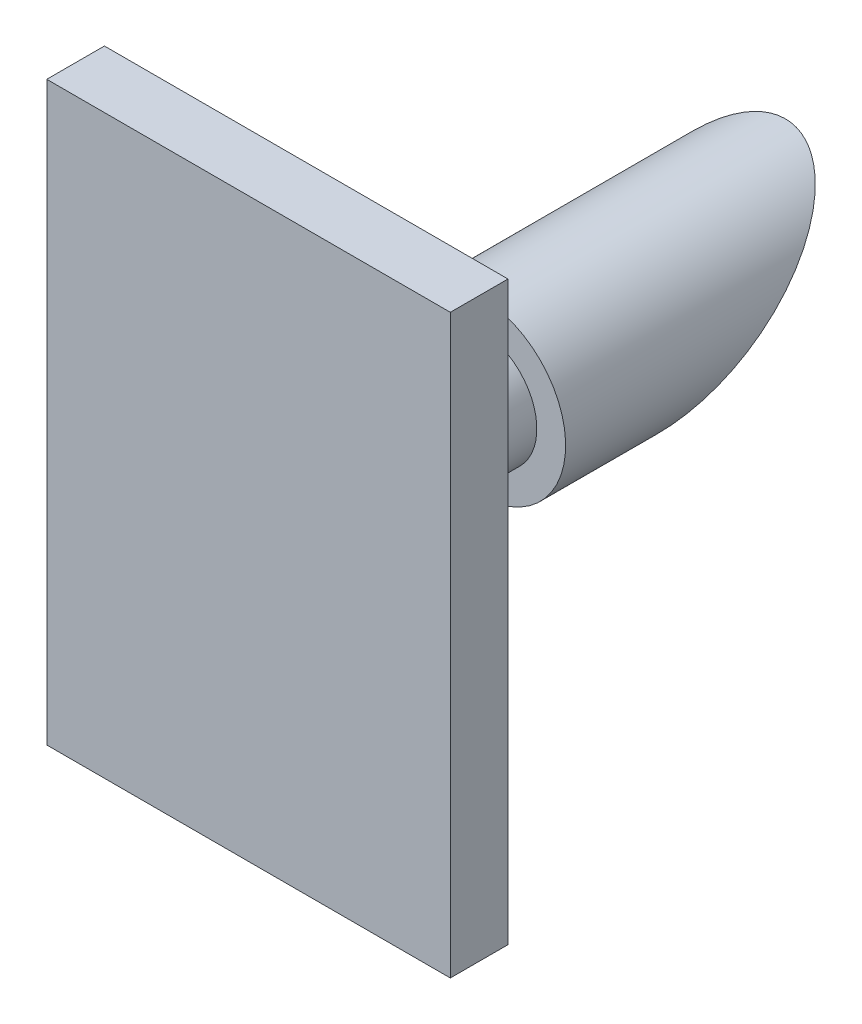
ISO-10303-21;
HEADER;
FILE_DESCRIPTION(('STEP AP214'),'2;1');
FILE_NAME('part.step','',(''),(''),'','','');
FILE_SCHEMA(('AUTOMOTIVE_DESIGN { 1 0 10303 214 1 1 1 1 }'));
ENDSEC;
DATA;
#1=APPLICATION_CONTEXT('core data for automotive mechanical design processes');
#2=APPLICATION_PROTOCOL_DEFINITION('international standard','automotive_design',2000,#1);
#3=PRODUCT_CONTEXT('',#1,'mechanical');
#4=PRODUCT('Part','Part','',(#3));
#5=PRODUCT_RELATED_PRODUCT_CATEGORY('part','',(#4));
#6=PRODUCT_DEFINITION_FORMATION('','',#4);
#7=PRODUCT_DEFINITION_CONTEXT('part definition',#1,'design');
#8=PRODUCT_DEFINITION('design','',#6,#7);
#9=PRODUCT_DEFINITION_SHAPE('','',#8);
#10=(LENGTH_UNIT() NAMED_UNIT(*) SI_UNIT(.MILLI.,.METRE.));
#11=(NAMED_UNIT(*) PLANE_ANGLE_UNIT() SI_UNIT($,.RADIAN.));
#12=(NAMED_UNIT(*) SI_UNIT($,.STERADIAN.) SOLID_ANGLE_UNIT());
#13=UNCERTAINTY_MEASURE_WITH_UNIT(LENGTH_MEASURE(1.E-05),#10,'distance_accuracy_value','');
#14=(GEOMETRIC_REPRESENTATION_CONTEXT(3) GLOBAL_UNCERTAINTY_ASSIGNED_CONTEXT((#13)) GLOBAL_UNIT_ASSIGNED_CONTEXT((#10,
#11,#12)) REPRESENTATION_CONTEXT('',''));
#15=CARTESIAN_POINT('',(0.,0.,0.));
#16=DIRECTION('',(0.,0.,1.));
#17=DIRECTION('',(1.,0.,0.));
#18=AXIS2_PLACEMENT_3D('',#15,#16,#17);
#19=CARTESIAN_POINT('',(0.,0.,-90.));
#20=DIRECTION('',(0.,0.,1.));
#21=DIRECTION('',(1.,0.,0.));
#22=AXIS2_PLACEMENT_3D('',#19,#20,#21);
#23=CYLINDRICAL_SURFACE('',#22,15.);
#24=CARTESIAN_POINT('',(0.,0.,-30.));
#25=DIRECTION('',(0.,0.,-1.));
#26=DIRECTION('',(-1.,0.,0.));
#27=AXIS2_PLACEMENT_3D('',#24,#25,#26);
#28=CIRCLE('',#27,15.);
#29=CARTESIAN_POINT('',(-15.,0.,-30.));
#30=VERTEX_POINT('',#29);
#31=EDGE_CURVE('E131',#30,#30,#28,.T.);
#32=ORIENTED_EDGE('',*,*,#31,.T.);
#33=EDGE_LOOP('',(#32));
#34=FACE_BOUND('',#33,.T.);
#35=CARTESIAN_POINT('',(0.,0.,-63.9428204024711));
#36=DIRECTION('',(0.,-0.787757305861332,-0.615985736086555));
#37=DIRECTION('',(0.,-0.615985736086555,0.787757305861332));
#38=AXIS2_PLACEMENT_3D('',#35,#36,#37);
#39=ELLIPSE('',#38,24.351213220126,15.);
#40=CARTESIAN_POINT('',(0.,-15.,-44.7599742817298));
#41=VERTEX_POINT('',#40);
#42=EDGE_CURVE('E11',#41,#41,#39,.T.);
#43=ORIENTED_EDGE('',*,*,#42,.F.);
#44=EDGE_LOOP('',(#43));
#45=FACE_BOUND('',#44,.T.);
#46=ADVANCED_FACE('F43',(#34,#45),#23,.T.);
#47=CARTESIAN_POINT('',(35.,-50.,10.));
#48=DIRECTION('',(-1.,0.,0.));
#49=DIRECTION('',(0.,0.,1.));
#50=AXIS2_PLACEMENT_3D('',#47,#48,#49);
#51=PLANE('',#50);
#52=DIRECTION('',(0.,1.,0.));
#53=VECTOR('',#52,1.);
#54=CARTESIAN_POINT('',(35.,-50.,0.));
#55=LINE('',#54,#53);
#56=CARTESIAN_POINT('',(35.,-50.,0.));
#57=VERTEX_POINT('',#56);
#58=CARTESIAN_POINT('',(35.,50.,0.));
#59=VERTEX_POINT('',#58);
#60=EDGE_CURVE('E114',#57,#59,#55,.T.);
#61=ORIENTED_EDGE('',*,*,#60,.T.);
#62=DIRECTION('',(0.,0.,-1.));
#63=VECTOR('',#62,1.);
#64=CARTESIAN_POINT('',(35.,50.,10.));
#65=LINE('',#64,#63);
#66=CARTESIAN_POINT('',(35.,50.,10.));
#67=VERTEX_POINT('',#66);
#68=EDGE_CURVE('E102',#67,#59,#65,.T.);
#69=ORIENTED_EDGE('',*,*,#68,.F.);
#70=DIRECTION('',(0.,1.,0.));
#71=VECTOR('',#70,1.);
#72=CARTESIAN_POINT('',(35.,-50.,10.));
#73=LINE('',#72,#71);
#74=CARTESIAN_POINT('',(35.,-50.,10.));
#75=VERTEX_POINT('',#74);
#76=EDGE_CURVE('E96',#75,#67,#73,.T.);
#77=ORIENTED_EDGE('',*,*,#76,.F.);
#78=DIRECTION('',(0.,0.,-1.));
#79=VECTOR('',#78,1.);
#80=CARTESIAN_POINT('',(35.,-50.,10.));
#81=LINE('',#80,#79);
#82=EDGE_CURVE('E110',#75,#57,#81,.T.);
#83=ORIENTED_EDGE('',*,*,#82,.T.);
#84=EDGE_LOOP('',(#61,#69,#77,#83));
#85=FACE_BOUND('',#84,.T.);
#86=ADVANCED_FACE('F45',(#85),#51,.F.);
#87=CARTESIAN_POINT('',(-35.,50.,10.));
#88=DIRECTION('',(0.,-1.,0.));
#89=DIRECTION('',(0.,0.,-1.));
#90=AXIS2_PLACEMENT_3D('',#87,#88,#89);
#91=PLANE('',#90);
#92=DIRECTION('',(-1.,0.,0.));
#93=VECTOR('',#92,1.);
#94=CARTESIAN_POINT('',(-35.,50.,0.));
#95=LINE('',#94,#93);
#96=CARTESIAN_POINT('',(-35.,50.,0.));
#97=VERTEX_POINT('',#96);
#98=EDGE_CURVE('E101',#59,#97,#95,.T.);
#99=ORIENTED_EDGE('',*,*,#98,.T.);
#100=DIRECTION('',(0.,0.,-1.));
#101=VECTOR('',#100,1.);
#102=CARTESIAN_POINT('',(-35.,50.,10.));
#103=LINE('',#102,#101);
#104=CARTESIAN_POINT('',(-35.,50.,10.));
#105=VERTEX_POINT('',#104);
#106=EDGE_CURVE('E99',#105,#97,#103,.T.);
#107=ORIENTED_EDGE('',*,*,#106,.F.);
#108=DIRECTION('',(-1.,0.,0.));
#109=VECTOR('',#108,1.);
#110=CARTESIAN_POINT('',(-35.,50.,10.));
#111=LINE('',#110,#109);
#112=EDGE_CURVE('E91',#67,#105,#111,.T.);
#113=ORIENTED_EDGE('',*,*,#112,.F.);
#114=ORIENTED_EDGE('',*,*,#68,.T.);
#115=EDGE_LOOP('',(#99,#107,#113,#114));
#116=FACE_BOUND('',#115,.T.);
#117=ADVANCED_FACE('F100',(#116),#91,.F.);
#118=CARTESIAN_POINT('',(-35.,-50.,10.));
#119=DIRECTION('',(1.,0.,0.));
#120=DIRECTION('',(0.,0.,-1.));
#121=AXIS2_PLACEMENT_3D('',#118,#119,#120);
#122=PLANE('',#121);
#123=DIRECTION('',(0.,-1.,0.));
#124=VECTOR('',#123,1.);
#125=CARTESIAN_POINT('',(-35.,-50.,0.));
#126=LINE('',#125,#124);
#127=CARTESIAN_POINT('',(-35.,-50.,0.));
#128=VERTEX_POINT('',#127);
#129=EDGE_CURVE('E77',#97,#128,#126,.T.);
#130=ORIENTED_EDGE('',*,*,#129,.T.);
#131=DIRECTION('',(0.,0.,-1.));
#132=VECTOR('',#131,1.);
#133=CARTESIAN_POINT('',(-35.,-50.,10.));
#134=LINE('',#133,#132);
#135=CARTESIAN_POINT('',(-35.,-50.,10.));
#136=VERTEX_POINT('',#135);
#137=EDGE_CURVE('E103',#136,#128,#134,.T.);
#138=ORIENTED_EDGE('',*,*,#137,.F.);
#139=DIRECTION('',(0.,-1.,0.));
#140=VECTOR('',#139,1.);
#141=CARTESIAN_POINT('',(-35.,-50.,10.));
#142=LINE('',#141,#140);
#143=EDGE_CURVE('E94',#105,#136,#142,.T.);
#144=ORIENTED_EDGE('',*,*,#143,.F.);
#145=ORIENTED_EDGE('',*,*,#106,.T.);
#146=EDGE_LOOP('',(#130,#138,#144,#145));
#147=FACE_BOUND('',#146,.T.);
#148=ADVANCED_FACE('F105',(#147),#122,.F.);
#149=CARTESIAN_POINT('',(-35.,-50.,10.));
#150=DIRECTION('',(0.,1.,0.));
#151=DIRECTION('',(0.,0.,1.));
#152=AXIS2_PLACEMENT_3D('',#149,#150,#151);
#153=PLANE('',#152);
#154=DIRECTION('',(1.,0.,0.));
#155=VECTOR('',#154,1.);
#156=CARTESIAN_POINT('',(-35.,-50.,0.));
#157=LINE('',#156,#155);
#158=EDGE_CURVE('E83',#128,#57,#157,.T.);
#159=ORIENTED_EDGE('',*,*,#158,.T.);
#160=ORIENTED_EDGE('',*,*,#82,.F.);
#161=DIRECTION('',(1.,0.,0.));
#162=VECTOR('',#161,1.);
#163=CARTESIAN_POINT('',(-35.,-50.,10.));
#164=LINE('',#163,#162);
#165=EDGE_CURVE('E60',#136,#75,#164,.T.);
#166=ORIENTED_EDGE('',*,*,#165,.F.);
#167=ORIENTED_EDGE('',*,*,#137,.T.);
#168=EDGE_LOOP('',(#159,#160,#166,#167));
#169=FACE_BOUND('',#168,.T.);
#170=ADVANCED_FACE('F162',(#169),#153,.F.);
#171=CARTESIAN_POINT('',(0.,0.,10.));
#172=DIRECTION('',(0.,0.,-1.));
#173=DIRECTION('',(-1.,0.,0.));
#174=AXIS2_PLACEMENT_3D('',#171,#172,#173);
#175=PLANE('',#174);
#176=ORIENTED_EDGE('',*,*,#76,.T.);
#177=ORIENTED_EDGE('',*,*,#112,.T.);
#178=ORIENTED_EDGE('',*,*,#143,.T.);
#179=ORIENTED_EDGE('',*,*,#165,.T.);
#180=EDGE_LOOP('',(#176,#177,#178,#179));
#181=FACE_BOUND('',#180,.T.);
#182=ADVANCED_FACE('F92',(#181),#175,.F.);
#183=CARTESIAN_POINT('',(0.,0.,0.));
#184=DIRECTION('',(0.,0.,-1.));
#185=DIRECTION('',(-1.,0.,0.));
#186=AXIS2_PLACEMENT_3D('',#183,#184,#185);
#187=PLANE('',#186);
#188=CARTESIAN_POINT('',(0.,0.,0.));
#189=DIRECTION('',(0.,0.,-1.));
#190=DIRECTION('',(-1.,0.,0.));
#191=AXIS2_PLACEMENT_3D('',#188,#189,#190);
#192=CIRCLE('',#191,10.);
#193=CARTESIAN_POINT('',(-10.,0.,0.));
#194=VERTEX_POINT('',#193);
#195=EDGE_CURVE('E52',#194,#194,#192,.T.);
#196=ORIENTED_EDGE('',*,*,#195,.F.);
#197=EDGE_LOOP('',(#196));
#198=FACE_BOUND('',#197,.T.);
#199=ORIENTED_EDGE('',*,*,#60,.F.);
#200=ORIENTED_EDGE('',*,*,#158,.F.);
#201=ORIENTED_EDGE('',*,*,#129,.F.);
#202=ORIENTED_EDGE('',*,*,#98,.F.);
#203=EDGE_LOOP('',(#199,#200,#201,#202));
#204=FACE_BOUND('',#203,.T.);
#205=ADVANCED_FACE('F151',(#198,#204),#187,.T.);
#206=CARTESIAN_POINT('',(0.,0.,-30.));
#207=DIRECTION('',(0.,0.,1.));
#208=DIRECTION('',(1.,0.,0.));
#209=AXIS2_PLACEMENT_3D('',#206,#207,#208);
#210=CYLINDRICAL_SURFACE('',#209,10.);
#211=CARTESIAN_POINT('',(0.,0.,-30.));
#212=DIRECTION('',(0.,0.,-1.));
#213=DIRECTION('',(-1.,0.,0.));
#214=AXIS2_PLACEMENT_3D('',#211,#212,#213);
#215=CIRCLE('',#214,10.);
#216=CARTESIAN_POINT('',(-10.,0.,-30.));
#217=VERTEX_POINT('',#216);
#218=EDGE_CURVE('E117',#217,#217,#215,.T.);
#219=ORIENTED_EDGE('',*,*,#218,.F.);
#220=EDGE_LOOP('',(#219));
#221=FACE_BOUND('',#220,.T.);
#222=ORIENTED_EDGE('',*,*,#195,.T.);
#223=EDGE_LOOP('',(#222));
#224=FACE_BOUND('',#223,.T.);
#225=ADVANCED_FACE('F141',(#221,#224),#210,.T.);
#226=CARTESIAN_POINT('',(0.,0.,-30.));
#227=DIRECTION('',(0.,0.,-1.));
#228=DIRECTION('',(-1.,0.,0.));
#229=AXIS2_PLACEMENT_3D('',#226,#227,#228);
#230=PLANE('',#229);
#231=ORIENTED_EDGE('',*,*,#218,.T.);
#232=EDGE_LOOP('',(#231));
#233=FACE_BOUND('',#232,.T.);
#234=ORIENTED_EDGE('',*,*,#31,.F.);
#235=EDGE_LOOP('',(#234));
#236=FACE_BOUND('',#235,.T.);
#237=ADVANCED_FACE('F138',(#233,#236),#230,.F.);
#238=CARTESIAN_POINT('',(-30.,-31.0280786468952,-24.2623631954277));
#239=DIRECTION('',(0.,-0.787757305861332,-0.615985736086555));
#240=DIRECTION('',(0.,0.615985736086555,-0.787757305861332));
#241=AXIS2_PLACEMENT_3D('',#238,#239,#240);
#242=PLANE('',#241);
#243=ORIENTED_EDGE('',*,*,#42,.T.);
#244=EDGE_LOOP('',(#243));
#245=FACE_BOUND('',#244,.T.);
#246=ADVANCED_FACE('F140',(#245),#242,.T.);
#247=CLOSED_SHELL('',(#46,#86,#117,#148,#170,#182,#205,#225,#237,#246));
#248=MANIFOLD_SOLID_BREP('B2',#247);
#249=ADVANCED_BREP_SHAPE_REPRESENTATION('',(#18,#248),#14);
#250=SHAPE_DEFINITION_REPRESENTATION(#9,#249);
ENDSEC;
END-ISO-10303-21;
